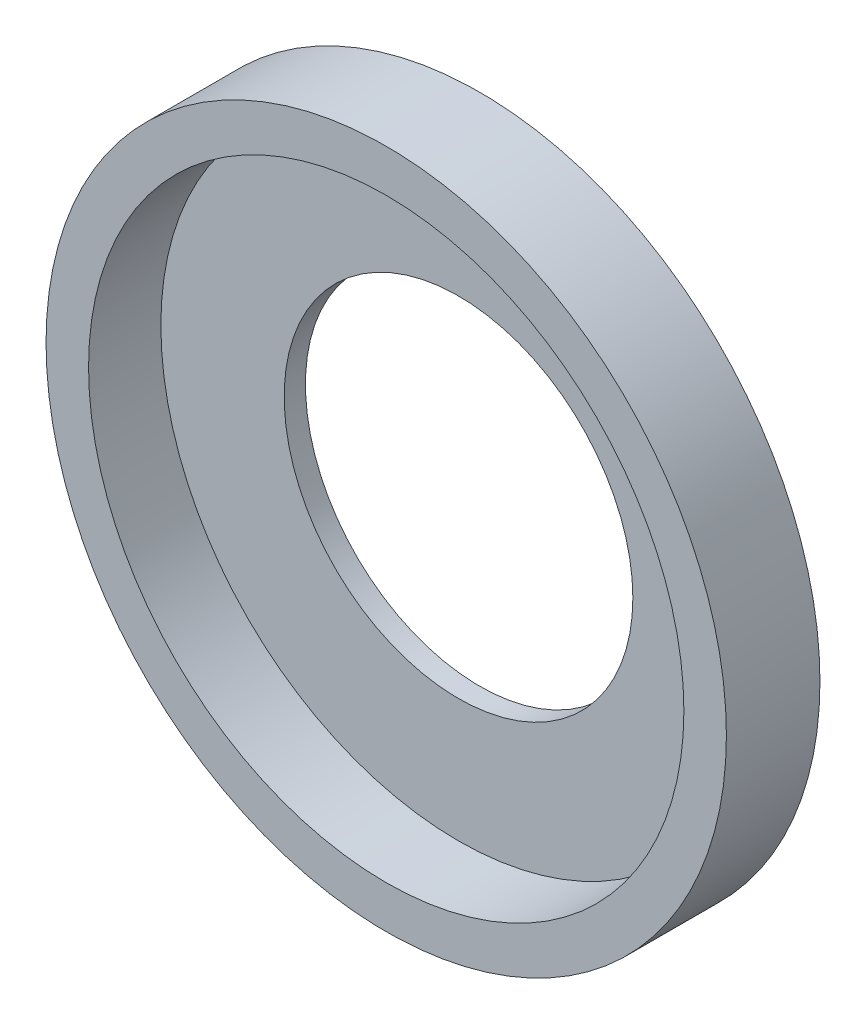
ISO-10303-21;
HEADER;
FILE_DESCRIPTION(('STEP AP214'),'2;1');
FILE_NAME('part.step','',(''),(''),'','','');
FILE_SCHEMA(('AUTOMOTIVE_DESIGN { 1 0 10303 214 1 1 1 1 }'));
ENDSEC;
DATA;
#1=APPLICATION_CONTEXT('core data for automotive mechanical design processes');
#2=APPLICATION_PROTOCOL_DEFINITION('international standard','automotive_design',2000,#1);
#3=PRODUCT_CONTEXT('',#1,'mechanical');
#4=PRODUCT('Part','Part','',(#3));
#5=PRODUCT_RELATED_PRODUCT_CATEGORY('part','',(#4));
#6=PRODUCT_DEFINITION_FORMATION('','',#4);
#7=PRODUCT_DEFINITION_CONTEXT('part definition',#1,'design');
#8=PRODUCT_DEFINITION('design','',#6,#7);
#9=PRODUCT_DEFINITION_SHAPE('','',#8);
#10=(LENGTH_UNIT() NAMED_UNIT(*) SI_UNIT(.MILLI.,.METRE.));
#11=(NAMED_UNIT(*) PLANE_ANGLE_UNIT() SI_UNIT($,.RADIAN.));
#12=(NAMED_UNIT(*) SI_UNIT($,.STERADIAN.) SOLID_ANGLE_UNIT());
#13=UNCERTAINTY_MEASURE_WITH_UNIT(LENGTH_MEASURE(1.E-05),#10,'distance_accuracy_value','');
#14=(GEOMETRIC_REPRESENTATION_CONTEXT(3) GLOBAL_UNCERTAINTY_ASSIGNED_CONTEXT((#13)) GLOBAL_UNIT_ASSIGNED_CONTEXT((#10,
#11,#12)) REPRESENTATION_CONTEXT('',''));
#15=CARTESIAN_POINT('',(0.,0.,0.));
#16=DIRECTION('',(0.,0.,1.));
#17=DIRECTION('',(1.,0.,0.));
#18=AXIS2_PLACEMENT_3D('',#15,#16,#17);
#19=CARTESIAN_POINT('',(0.,0.,-3.));
#20=DIRECTION('',(0.,0.,1.));
#21=DIRECTION('',(1.,0.,0.));
#22=AXIS2_PLACEMENT_3D('',#19,#20,#21);
#23=PLANE('',#22);
#24=CARTESIAN_POINT('',(0.,0.,-3.));
#25=DIRECTION('',(0.,0.,1.));
#26=DIRECTION('',(1.,0.,0.));
#27=AXIS2_PLACEMENT_3D('',#24,#25,#26);
#28=CIRCLE('',#27,4.1);
#29=CARTESIAN_POINT('',(4.1,0.,-3.));
#30=VERTEX_POINT('',#29);
#31=EDGE_CURVE('E46',#30,#30,#28,.T.);
#32=ORIENTED_EDGE('',*,*,#31,.F.);
#33=EDGE_LOOP('',(#32));
#34=FACE_BOUND('',#33,.T.);
#35=CARTESIAN_POINT('',(0.,0.,-3.));
#36=DIRECTION('',(0.,0.,1.));
#37=DIRECTION('',(1.,0.,0.));
#38=AXIS2_PLACEMENT_3D('',#35,#36,#37);
#39=CIRCLE('',#38,7.);
#40=CARTESIAN_POINT('',(7.,0.,-3.));
#41=VERTEX_POINT('',#40);
#42=EDGE_CURVE('E58',#41,#41,#39,.T.);
#43=ORIENTED_EDGE('',*,*,#42,.T.);
#44=EDGE_LOOP('',(#43));
#45=FACE_BOUND('',#44,.T.);
#46=ADVANCED_FACE('F39',(#34,#45),#23,.T.);
#47=CARTESIAN_POINT('',(0.,0.,-3.5));
#48=DIRECTION('',(0.,0.,1.));
#49=DIRECTION('',(1.,0.,0.));
#50=AXIS2_PLACEMENT_3D('',#47,#48,#49);
#51=PLANE('',#50);
#52=CARTESIAN_POINT('',(0.,0.,-3.5));
#53=DIRECTION('',(0.,0.,1.));
#54=DIRECTION('',(1.,0.,0.));
#55=AXIS2_PLACEMENT_3D('',#52,#53,#54);
#56=CIRCLE('',#55,8.);
#57=CARTESIAN_POINT('',(8.,0.,-3.5));
#58=VERTEX_POINT('',#57);
#59=EDGE_CURVE('E10',#58,#58,#56,.T.);
#60=ORIENTED_EDGE('',*,*,#59,.F.);
#61=EDGE_LOOP('',(#60));
#62=FACE_BOUND('',#61,.T.);
#63=CARTESIAN_POINT('',(0.,0.,-3.5));
#64=DIRECTION('',(0.,0.,1.));
#65=DIRECTION('',(1.,0.,0.));
#66=AXIS2_PLACEMENT_3D('',#63,#64,#65);
#67=CIRCLE('',#66,4.1);
#68=CARTESIAN_POINT('',(4.1,0.,-3.5));
#69=VERTEX_POINT('',#68);
#70=EDGE_CURVE('E49',#69,#69,#67,.T.);
#71=ORIENTED_EDGE('',*,*,#70,.T.);
#72=EDGE_LOOP('',(#71));
#73=FACE_BOUND('',#72,.T.);
#74=ADVANCED_FACE('F85',(#62,#73),#51,.F.);
#75=CARTESIAN_POINT('',(0.,0.,-3.));
#76=DIRECTION('',(0.,0.,-1.));
#77=DIRECTION('',(-1.,0.,0.));
#78=AXIS2_PLACEMENT_3D('',#75,#76,#77);
#79=CYLINDRICAL_SURFACE('',#78,8.);
#80=ORIENTED_EDGE('',*,*,#59,.T.);
#81=EDGE_LOOP('',(#80));
#82=FACE_BOUND('',#81,.T.);
#83=CARTESIAN_POINT('',(0.,0.,-1.3));
#84=DIRECTION('',(0.,0.,1.));
#85=DIRECTION('',(1.,0.,0.));
#86=AXIS2_PLACEMENT_3D('',#83,#84,#85);
#87=CIRCLE('',#86,8.);
#88=CARTESIAN_POINT('',(8.,0.,-1.3));
#89=VERTEX_POINT('',#88);
#90=EDGE_CURVE('E54',#89,#89,#87,.T.);
#91=ORIENTED_EDGE('',*,*,#90,.F.);
#92=EDGE_LOOP('',(#91));
#93=FACE_BOUND('',#92,.T.);
#94=ADVANCED_FACE('F41',(#82,#93),#79,.T.);
#95=CARTESIAN_POINT('',(0.,0.,-3.));
#96=DIRECTION('',(0.,0.,-1.));
#97=DIRECTION('',(-1.,0.,0.));
#98=AXIS2_PLACEMENT_3D('',#95,#96,#97);
#99=CYLINDRICAL_SURFACE('',#98,4.1);
#100=ORIENTED_EDGE('',*,*,#31,.T.);
#101=EDGE_LOOP('',(#100));
#102=FACE_BOUND('',#101,.T.);
#103=ORIENTED_EDGE('',*,*,#70,.F.);
#104=EDGE_LOOP('',(#103));
#105=FACE_BOUND('',#104,.T.);
#106=ADVANCED_FACE('F73',(#102,#105),#99,.F.);
#107=CARTESIAN_POINT('',(0.,0.,-1.3));
#108=DIRECTION('',(0.,0.,1.));
#109=DIRECTION('',(1.,0.,0.));
#110=AXIS2_PLACEMENT_3D('',#107,#108,#109);
#111=PLANE('',#110);
#112=ORIENTED_EDGE('',*,*,#90,.T.);
#113=EDGE_LOOP('',(#112));
#114=FACE_BOUND('',#113,.T.);
#115=CARTESIAN_POINT('',(0.,0.,-1.3));
#116=DIRECTION('',(0.,0.,1.));
#117=DIRECTION('',(1.,0.,0.));
#118=AXIS2_PLACEMENT_3D('',#115,#116,#117);
#119=CIRCLE('',#118,7.);
#120=CARTESIAN_POINT('',(7.,0.,-1.3));
#121=VERTEX_POINT('',#120);
#122=EDGE_CURVE('E56',#121,#121,#119,.T.);
#123=ORIENTED_EDGE('',*,*,#122,.F.);
#124=EDGE_LOOP('',(#123));
#125=FACE_BOUND('',#124,.T.);
#126=ADVANCED_FACE('F69',(#114,#125),#111,.T.);
#127=CARTESIAN_POINT('',(0.,0.,-1.3));
#128=DIRECTION('',(0.,0.,-1.));
#129=DIRECTION('',(-1.,0.,0.));
#130=AXIS2_PLACEMENT_3D('',#127,#128,#129);
#131=CYLINDRICAL_SURFACE('',#130,7.);
#132=ORIENTED_EDGE('',*,*,#122,.T.);
#133=EDGE_LOOP('',(#132));
#134=FACE_BOUND('',#133,.T.);
#135=ORIENTED_EDGE('',*,*,#42,.F.);
#136=EDGE_LOOP('',(#135));
#137=FACE_BOUND('',#136,.T.);
#138=ADVANCED_FACE('F67',(#134,#137),#131,.F.);
#139=CLOSED_SHELL('',(#46,#74,#94,#106,#126,#138));
#140=MANIFOLD_SOLID_BREP('B2',#139);
#141=ADVANCED_BREP_SHAPE_REPRESENTATION('',(#18,#140),#14);
#142=SHAPE_DEFINITION_REPRESENTATION(#9,#141);
ENDSEC;
END-ISO-10303-21;
